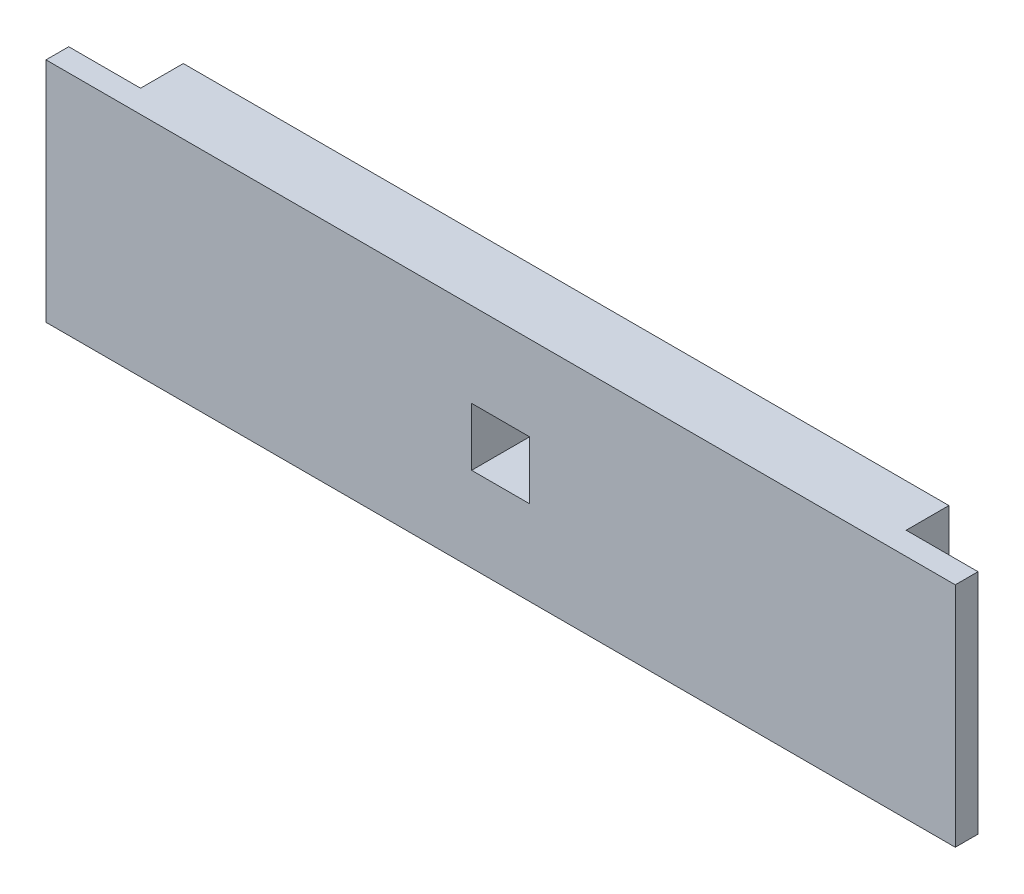
ISO-10303-21;
HEADER;
FILE_DESCRIPTION(('STEP AP214'),'2;1');
FILE_NAME('part.step','',(''),(''),'','','');
FILE_SCHEMA(('AUTOMOTIVE_DESIGN { 1 0 10303 214 1 1 1 1 }'));
ENDSEC;
DATA;
#1=APPLICATION_CONTEXT('core data for automotive mechanical design processes');
#2=APPLICATION_PROTOCOL_DEFINITION('international standard','automotive_design',2000,#1);
#3=PRODUCT_CONTEXT('',#1,'mechanical');
#4=PRODUCT('Part','Part','',(#3));
#5=PRODUCT_RELATED_PRODUCT_CATEGORY('part','',(#4));
#6=PRODUCT_DEFINITION_FORMATION('','',#4);
#7=PRODUCT_DEFINITION_CONTEXT('part definition',#1,'design');
#8=PRODUCT_DEFINITION('design','',#6,#7);
#9=PRODUCT_DEFINITION_SHAPE('','',#8);
#10=(LENGTH_UNIT() NAMED_UNIT(*) SI_UNIT(.MILLI.,.METRE.));
#11=(NAMED_UNIT(*) PLANE_ANGLE_UNIT() SI_UNIT($,.RADIAN.));
#12=(NAMED_UNIT(*) SI_UNIT($,.STERADIAN.) SOLID_ANGLE_UNIT());
#13=UNCERTAINTY_MEASURE_WITH_UNIT(LENGTH_MEASURE(1.E-05),#10,'distance_accuracy_value','');
#14=(GEOMETRIC_REPRESENTATION_CONTEXT(3) GLOBAL_UNCERTAINTY_ASSIGNED_CONTEXT((#13)) GLOBAL_UNIT_ASSIGNED_CONTEXT((#10,
#11,#12)) REPRESENTATION_CONTEXT('',''));
#15=CARTESIAN_POINT('',(0.,0.,0.));
#16=DIRECTION('',(0.,0.,1.));
#17=DIRECTION('',(1.,0.,0.));
#18=AXIS2_PLACEMENT_3D('',#15,#16,#17);
#19=CARTESIAN_POINT('',(0.,0.,18.288));
#20=DIRECTION('',(1.,0.,0.));
#21=DIRECTION('',(0.,0.,-1.));
#22=AXIS2_PLACEMENT_3D('',#19,#20,#21);
#23=PLANE('',#22);
#24=DIRECTION('',(0.,-1.,0.));
#25=VECTOR('',#24,1.);
#26=CARTESIAN_POINT('',(0.,63.5,11.938));
#27=LINE('',#26,#25);
#28=CARTESIAN_POINT('',(0.,63.5,11.938));
#29=VERTEX_POINT('',#28);
#30=CARTESIAN_POINT('',(0.,0.,11.938));
#31=VERTEX_POINT('',#30);
#32=EDGE_CURVE('E187',#29,#31,#27,.T.);
#33=ORIENTED_EDGE('',*,*,#32,.T.);
#34=DIRECTION('',(0.,0.,-1.));
#35=VECTOR('',#34,1.);
#36=CARTESIAN_POINT('',(0.,0.,18.288));
#37=LINE('',#36,#35);
#38=CARTESIAN_POINT('',(0.,0.,18.288));
#39=VERTEX_POINT('',#38);
#40=EDGE_CURVE('E12',#39,#31,#37,.T.);
#41=ORIENTED_EDGE('',*,*,#40,.F.);
#42=DIRECTION('',(0.,-1.,0.));
#43=VECTOR('',#42,1.);
#44=CARTESIAN_POINT('',(0.,0.,18.288));
#45=LINE('',#44,#43);
#46=CARTESIAN_POINT('',(0.,63.5,18.288));
#47=VERTEX_POINT('',#46);
#48=EDGE_CURVE('E144',#47,#39,#45,.T.);
#49=ORIENTED_EDGE('',*,*,#48,.F.);
#50=DIRECTION('',(0.,0.,-1.));
#51=VECTOR('',#50,1.);
#52=CARTESIAN_POINT('',(0.,63.5,18.288));
#53=LINE('',#52,#51);
#54=EDGE_CURVE('E154',#47,#29,#53,.T.);
#55=ORIENTED_EDGE('',*,*,#54,.T.);
#56=EDGE_LOOP('',(#33,#41,#49,#55));
#57=FACE_BOUND('',#56,.T.);
#58=ADVANCED_FACE('F36',(#57),#23,.F.);
#59=CARTESIAN_POINT('',(254.,0.,18.288));
#60=DIRECTION('',(-1.,0.,0.));
#61=DIRECTION('',(0.,0.,1.));
#62=AXIS2_PLACEMENT_3D('',#59,#60,#61);
#63=PLANE('',#62);
#64=DIRECTION('',(0.,1.,0.));
#65=VECTOR('',#64,1.);
#66=CARTESIAN_POINT('',(254.,63.5,11.938));
#67=LINE('',#66,#65);
#68=CARTESIAN_POINT('',(254.,0.,11.938));
#69=VERTEX_POINT('',#68);
#70=CARTESIAN_POINT('',(254.,63.5,11.938));
#71=VERTEX_POINT('',#70);
#72=EDGE_CURVE('E166',#69,#71,#67,.T.);
#73=ORIENTED_EDGE('',*,*,#72,.T.);
#74=DIRECTION('',(0.,0.,-1.));
#75=VECTOR('',#74,1.);
#76=CARTESIAN_POINT('',(254.,63.5,18.288));
#77=LINE('',#76,#75);
#78=CARTESIAN_POINT('',(254.,63.5,18.288));
#79=VERTEX_POINT('',#78);
#80=EDGE_CURVE('E157',#79,#71,#77,.T.);
#81=ORIENTED_EDGE('',*,*,#80,.F.);
#82=DIRECTION('',(0.,1.,0.));
#83=VECTOR('',#82,1.);
#84=CARTESIAN_POINT('',(254.,0.,18.288));
#85=LINE('',#84,#83);
#86=CARTESIAN_POINT('',(254.,0.,18.288));
#87=VERTEX_POINT('',#86);
#88=EDGE_CURVE('E167',#87,#79,#85,.T.);
#89=ORIENTED_EDGE('',*,*,#88,.F.);
#90=DIRECTION('',(0.,0.,-1.));
#91=VECTOR('',#90,1.);
#92=CARTESIAN_POINT('',(254.,0.,18.288));
#93=LINE('',#92,#91);
#94=EDGE_CURVE('E43',#87,#69,#93,.T.);
#95=ORIENTED_EDGE('',*,*,#94,.T.);
#96=EDGE_LOOP('',(#73,#81,#89,#95));
#97=FACE_BOUND('',#96,.T.);
#98=ADVANCED_FACE('F164',(#97),#63,.F.);
#99=CARTESIAN_POINT('',(0.,0.,18.288));
#100=DIRECTION('',(0.,1.,0.));
#101=DIRECTION('',(0.,0.,1.));
#102=AXIS2_PLACEMENT_3D('',#99,#100,#101);
#103=PLANE('',#102);
#104=DIRECTION('',(1.,0.,0.));
#105=VECTOR('',#104,1.);
#106=CARTESIAN_POINT('',(0.,0.,0.));
#107=LINE('',#106,#105);
#108=CARTESIAN_POINT('',(20.066,0.,0.));
#109=VERTEX_POINT('',#108);
#110=CARTESIAN_POINT('',(233.934,0.,0.));
#111=VERTEX_POINT('',#110);
#112=EDGE_CURVE('E145',#109,#111,#107,.T.);
#113=ORIENTED_EDGE('',*,*,#112,.T.);
#114=DIRECTION('',(0.,0.,-1.));
#115=VECTOR('',#114,1.);
#116=CARTESIAN_POINT('',(233.934,0.,84.8830024851716));
#117=LINE('',#116,#115);
#118=CARTESIAN_POINT('',(233.934,0.,11.938));
#119=VERTEX_POINT('',#118);
#120=EDGE_CURVE('E50',#119,#111,#117,.T.);
#121=ORIENTED_EDGE('',*,*,#120,.F.);
#122=DIRECTION('',(1.,0.,0.));
#123=VECTOR('',#122,1.);
#124=CARTESIAN_POINT('',(254.,0.,11.938));
#125=LINE('',#124,#123);
#126=EDGE_CURVE('E139',#119,#69,#125,.T.);
#127=ORIENTED_EDGE('',*,*,#126,.T.);
#128=ORIENTED_EDGE('',*,*,#94,.F.);
#129=DIRECTION('',(1.,0.,0.));
#130=VECTOR('',#129,1.);
#131=CARTESIAN_POINT('',(0.,0.,18.288));
#132=LINE('',#131,#130);
#133=EDGE_CURVE('E148',#39,#87,#132,.T.);
#134=ORIENTED_EDGE('',*,*,#133,.F.);
#135=ORIENTED_EDGE('',*,*,#40,.T.);
#136=DIRECTION('',(1.,0.,0.));
#137=VECTOR('',#136,1.);
#138=CARTESIAN_POINT('',(0.,0.,11.938));
#139=LINE('',#138,#137);
#140=CARTESIAN_POINT('',(20.066,0.,11.938));
#141=VERTEX_POINT('',#140);
#142=EDGE_CURVE('E183',#31,#141,#139,.T.);
#143=ORIENTED_EDGE('',*,*,#142,.T.);
#144=DIRECTION('',(0.,0.,-1.));
#145=VECTOR('',#144,1.);
#146=CARTESIAN_POINT('',(20.066,0.,84.8830024851716));
#147=LINE('',#146,#145);
#148=EDGE_CURVE('E184',#141,#109,#147,.T.);
#149=ORIENTED_EDGE('',*,*,#148,.T.);
#150=EDGE_LOOP('',(#113,#121,#127,#128,#134,#135,#143,#149));
#151=FACE_BOUND('',#150,.T.);
#152=ADVANCED_FACE('F170',(#151),#103,.F.);
#153=CARTESIAN_POINT('',(0.,63.5,18.288));
#154=DIRECTION('',(0.,-1.,0.));
#155=DIRECTION('',(0.,0.,-1.));
#156=AXIS2_PLACEMENT_3D('',#153,#154,#155);
#157=PLANE('',#156);
#158=DIRECTION('',(-1.,0.,0.));
#159=VECTOR('',#158,1.);
#160=CARTESIAN_POINT('',(233.934,63.5,11.938));
#161=LINE('',#160,#159);
#162=CARTESIAN_POINT('',(233.934,63.5,11.938));
#163=VERTEX_POINT('',#162);
#164=EDGE_CURVE('E138',#71,#163,#161,.T.);
#165=ORIENTED_EDGE('',*,*,#164,.T.);
#166=DIRECTION('',(0.,0.,-1.));
#167=VECTOR('',#166,1.);
#168=CARTESIAN_POINT('',(233.934,63.5,84.8830024851716));
#169=LINE('',#168,#167);
#170=CARTESIAN_POINT('',(233.934,63.5,0.));
#171=VERTEX_POINT('',#170);
#172=EDGE_CURVE('E125',#163,#171,#169,.T.);
#173=ORIENTED_EDGE('',*,*,#172,.T.);
#174=DIRECTION('',(-1.,0.,0.));
#175=VECTOR('',#174,1.);
#176=CARTESIAN_POINT('',(0.,63.5,0.));
#177=LINE('',#176,#175);
#178=CARTESIAN_POINT('',(20.066,63.5,0.));
#179=VERTEX_POINT('',#178);
#180=EDGE_CURVE('E136',#171,#179,#177,.T.);
#181=ORIENTED_EDGE('',*,*,#180,.T.);
#182=DIRECTION('',(0.,0.,-1.));
#183=VECTOR('',#182,1.);
#184=CARTESIAN_POINT('',(20.066,63.5,84.8830024851716));
#185=LINE('',#184,#183);
#186=CARTESIAN_POINT('',(20.066,63.5,11.938));
#187=VERTEX_POINT('',#186);
#188=EDGE_CURVE('E58',#187,#179,#185,.T.);
#189=ORIENTED_EDGE('',*,*,#188,.F.);
#190=DIRECTION('',(-1.,0.,0.));
#191=VECTOR('',#190,1.);
#192=CARTESIAN_POINT('',(20.066,63.5,11.938));
#193=LINE('',#192,#191);
#194=EDGE_CURVE('E131',#187,#29,#193,.T.);
#195=ORIENTED_EDGE('',*,*,#194,.T.);
#196=ORIENTED_EDGE('',*,*,#54,.F.);
#197=DIRECTION('',(-1.,0.,0.));
#198=VECTOR('',#197,1.);
#199=CARTESIAN_POINT('',(0.,63.5,18.288));
#200=LINE('',#199,#198);
#201=EDGE_CURVE('E158',#79,#47,#200,.T.);
#202=ORIENTED_EDGE('',*,*,#201,.F.);
#203=ORIENTED_EDGE('',*,*,#80,.T.);
#204=EDGE_LOOP('',(#165,#173,#181,#189,#195,#196,#202,#203));
#205=FACE_BOUND('',#204,.T.);
#206=ADVANCED_FACE('F135',(#205),#157,.F.);
#207=CARTESIAN_POINT('',(0.,0.,18.288));
#208=DIRECTION('',(0.,0.,-1.));
#209=DIRECTION('',(-1.,0.,0.));
#210=AXIS2_PLACEMENT_3D('',#207,#208,#209);
#211=PLANE('',#210);
#212=DIRECTION('',(-1.,0.,0.));
#213=VECTOR('',#212,1.);
#214=CARTESIAN_POINT('',(118.8974,39.8526,18.288));
#215=LINE('',#214,#213);
#216=CARTESIAN_POINT('',(135.1026,39.8526,18.288));
#217=VERTEX_POINT('',#216);
#218=CARTESIAN_POINT('',(118.8974,39.8526,18.288));
#219=VERTEX_POINT('',#218);
#220=EDGE_CURVE('E211',#217,#219,#215,.T.);
#221=ORIENTED_EDGE('',*,*,#220,.F.);
#222=DIRECTION('',(0.,1.,0.));
#223=VECTOR('',#222,1.);
#224=CARTESIAN_POINT('',(135.1026,23.6474,18.288));
#225=LINE('',#224,#223);
#226=CARTESIAN_POINT('',(135.1026,23.6474,18.288));
#227=VERTEX_POINT('',#226);
#228=EDGE_CURVE('E180',#227,#217,#225,.T.);
#229=ORIENTED_EDGE('',*,*,#228,.F.);
#230=DIRECTION('',(1.,0.,0.));
#231=VECTOR('',#230,1.);
#232=CARTESIAN_POINT('',(118.8974,23.6474,18.288));
#233=LINE('',#232,#231);
#234=CARTESIAN_POINT('',(118.8974,23.6474,18.288));
#235=VERTEX_POINT('',#234);
#236=EDGE_CURVE('E200',#235,#227,#233,.T.);
#237=ORIENTED_EDGE('',*,*,#236,.F.);
#238=DIRECTION('',(0.,-1.,0.));
#239=VECTOR('',#238,1.);
#240=CARTESIAN_POINT('',(118.8974,23.6474,18.288));
#241=LINE('',#240,#239);
#242=EDGE_CURVE('E214',#219,#235,#241,.T.);
#243=ORIENTED_EDGE('',*,*,#242,.F.);
#244=EDGE_LOOP('',(#221,#229,#237,#243));
#245=FACE_BOUND('',#244,.T.);
#246=ORIENTED_EDGE('',*,*,#48,.T.);
#247=ORIENTED_EDGE('',*,*,#133,.T.);
#248=ORIENTED_EDGE('',*,*,#88,.T.);
#249=ORIENTED_EDGE('',*,*,#201,.T.);
#250=EDGE_LOOP('',(#246,#247,#248,#249));
#251=FACE_BOUND('',#250,.T.);
#252=ADVANCED_FACE('F230',(#245,#251),#211,.F.);
#253=CARTESIAN_POINT('',(0.,0.,0.));
#254=DIRECTION('',(0.,0.,-1.));
#255=DIRECTION('',(-1.,0.,0.));
#256=AXIS2_PLACEMENT_3D('',#253,#254,#255);
#257=PLANE('',#256);
#258=DIRECTION('',(0.,1.,0.));
#259=VECTOR('',#258,1.);
#260=CARTESIAN_POINT('',(233.934,63.5,0.));
#261=LINE('',#260,#259);
#262=EDGE_CURVE('E122',#111,#171,#261,.T.);
#263=ORIENTED_EDGE('',*,*,#262,.F.);
#264=ORIENTED_EDGE('',*,*,#112,.F.);
#265=DIRECTION('',(0.,-1.,0.));
#266=VECTOR('',#265,1.);
#267=CARTESIAN_POINT('',(20.066,63.5,0.));
#268=LINE('',#267,#266);
#269=EDGE_CURVE('E143',#179,#109,#268,.T.);
#270=ORIENTED_EDGE('',*,*,#269,.F.);
#271=ORIENTED_EDGE('',*,*,#180,.F.);
#272=EDGE_LOOP('',(#263,#264,#270,#271));
#273=FACE_BOUND('',#272,.T.);
#274=DIRECTION('',(0.,1.,0.));
#275=VECTOR('',#274,1.);
#276=CARTESIAN_POINT('',(135.1026,23.6474,0.));
#277=LINE('',#276,#275);
#278=CARTESIAN_POINT('',(135.1026,23.6474,0.));
#279=VERTEX_POINT('',#278);
#280=CARTESIAN_POINT('',(135.1026,39.8526,0.));
#281=VERTEX_POINT('',#280);
#282=EDGE_CURVE('E196',#279,#281,#277,.T.);
#283=ORIENTED_EDGE('',*,*,#282,.T.);
#284=DIRECTION('',(-1.,0.,0.));
#285=VECTOR('',#284,1.);
#286=CARTESIAN_POINT('',(118.8974,39.8526,0.));
#287=LINE('',#286,#285);
#288=CARTESIAN_POINT('',(118.8974,39.8526,0.));
#289=VERTEX_POINT('',#288);
#290=EDGE_CURVE('E199',#281,#289,#287,.T.);
#291=ORIENTED_EDGE('',*,*,#290,.T.);
#292=DIRECTION('',(0.,-1.,0.));
#293=VECTOR('',#292,1.);
#294=CARTESIAN_POINT('',(118.8974,23.6474,0.));
#295=LINE('',#294,#293);
#296=CARTESIAN_POINT('',(118.8974,23.6474,0.));
#297=VERTEX_POINT('',#296);
#298=EDGE_CURVE('E203',#289,#297,#295,.T.);
#299=ORIENTED_EDGE('',*,*,#298,.T.);
#300=DIRECTION('',(1.,0.,0.));
#301=VECTOR('',#300,1.);
#302=CARTESIAN_POINT('',(118.8974,23.6474,0.));
#303=LINE('',#302,#301);
#304=EDGE_CURVE('E206',#297,#279,#303,.T.);
#305=ORIENTED_EDGE('',*,*,#304,.T.);
#306=EDGE_LOOP('',(#283,#291,#299,#305));
#307=FACE_BOUND('',#306,.T.);
#308=ADVANCED_FACE('F141',(#273,#307),#257,.T.);
#309=CARTESIAN_POINT('',(135.1026,23.6474,0.));
#310=DIRECTION('',(1.,0.,0.));
#311=DIRECTION('',(0.,0.,-1.));
#312=AXIS2_PLACEMENT_3D('',#309,#310,#311);
#313=PLANE('',#312);
#314=ORIENTED_EDGE('',*,*,#228,.T.);
#315=DIRECTION('',(0.,0.,1.));
#316=VECTOR('',#315,1.);
#317=CARTESIAN_POINT('',(135.1026,39.8526,0.));
#318=LINE('',#317,#316);
#319=EDGE_CURVE('E209',#281,#217,#318,.T.);
#320=ORIENTED_EDGE('',*,*,#319,.F.);
#321=ORIENTED_EDGE('',*,*,#282,.F.);
#322=DIRECTION('',(0.,0.,1.));
#323=VECTOR('',#322,1.);
#324=CARTESIAN_POINT('',(135.1026,23.6474,0.));
#325=LINE('',#324,#323);
#326=EDGE_CURVE('E150',#279,#227,#325,.T.);
#327=ORIENTED_EDGE('',*,*,#326,.T.);
#328=EDGE_LOOP('',(#314,#320,#321,#327));
#329=FACE_BOUND('',#328,.T.);
#330=ADVANCED_FACE('F264',(#329),#313,.F.);
#331=CARTESIAN_POINT('',(118.8974,23.6474,0.));
#332=DIRECTION('',(0.,-1.,0.));
#333=DIRECTION('',(1.,0.,0.));
#334=AXIS2_PLACEMENT_3D('',#331,#332,#333);
#335=PLANE('',#334);
#336=ORIENTED_EDGE('',*,*,#236,.T.);
#337=ORIENTED_EDGE('',*,*,#326,.F.);
#338=ORIENTED_EDGE('',*,*,#304,.F.);
#339=DIRECTION('',(0.,0.,1.));
#340=VECTOR('',#339,1.);
#341=CARTESIAN_POINT('',(118.8974,23.6474,0.));
#342=LINE('',#341,#340);
#343=EDGE_CURVE('E220',#297,#235,#342,.T.);
#344=ORIENTED_EDGE('',*,*,#343,.T.);
#345=EDGE_LOOP('',(#336,#337,#338,#344));
#346=FACE_BOUND('',#345,.T.);
#347=ADVANCED_FACE('F269',(#346),#335,.F.);
#348=CARTESIAN_POINT('',(118.8974,23.6474,0.));
#349=DIRECTION('',(-1.,0.,0.));
#350=DIRECTION('',(0.,0.,1.));
#351=AXIS2_PLACEMENT_3D('',#348,#349,#350);
#352=PLANE('',#351);
#353=ORIENTED_EDGE('',*,*,#242,.T.);
#354=ORIENTED_EDGE('',*,*,#343,.F.);
#355=ORIENTED_EDGE('',*,*,#298,.F.);
#356=DIRECTION('',(0.,0.,1.));
#357=VECTOR('',#356,1.);
#358=CARTESIAN_POINT('',(118.8974,39.8526,0.));
#359=LINE('',#358,#357);
#360=EDGE_CURVE('E222',#289,#219,#359,.T.);
#361=ORIENTED_EDGE('',*,*,#360,.T.);
#362=EDGE_LOOP('',(#353,#354,#355,#361));
#363=FACE_BOUND('',#362,.T.);
#364=ADVANCED_FACE('F247',(#363),#352,.F.);
#365=CARTESIAN_POINT('',(118.8974,39.8526,0.));
#366=DIRECTION('',(0.,1.,0.));
#367=DIRECTION('',(0.,0.,1.));
#368=AXIS2_PLACEMENT_3D('',#365,#366,#367);
#369=PLANE('',#368);
#370=ORIENTED_EDGE('',*,*,#220,.T.);
#371=ORIENTED_EDGE('',*,*,#360,.F.);
#372=ORIENTED_EDGE('',*,*,#290,.F.);
#373=ORIENTED_EDGE('',*,*,#319,.T.);
#374=EDGE_LOOP('',(#370,#371,#372,#373));
#375=FACE_BOUND('',#374,.T.);
#376=ADVANCED_FACE('F240',(#375),#369,.F.);
#377=CARTESIAN_POINT('',(20.066,63.5,84.8830024851716));
#378=DIRECTION('',(1.,0.,0.));
#379=DIRECTION('',(0.,1.,0.));
#380=AXIS2_PLACEMENT_3D('',#377,#378,#379);
#381=PLANE('',#380);
#382=DIRECTION('',(0.,1.,0.));
#383=VECTOR('',#382,1.);
#384=CARTESIAN_POINT('',(20.066,63.5,11.938));
#385=LINE('',#384,#383);
#386=EDGE_CURVE('E181',#141,#187,#385,.T.);
#387=ORIENTED_EDGE('',*,*,#386,.T.);
#388=ORIENTED_EDGE('',*,*,#188,.T.);
#389=ORIENTED_EDGE('',*,*,#269,.T.);
#390=ORIENTED_EDGE('',*,*,#148,.F.);
#391=EDGE_LOOP('',(#387,#388,#389,#390));
#392=FACE_BOUND('',#391,.T.);
#393=ADVANCED_FACE('F238',(#392),#381,.F.);
#394=CARTESIAN_POINT('',(0.,0.,11.938));
#395=DIRECTION('',(0.,0.,-1.));
#396=DIRECTION('',(-1.,0.,0.));
#397=AXIS2_PLACEMENT_3D('',#394,#395,#396);
#398=PLANE('',#397);
#399=ORIENTED_EDGE('',*,*,#32,.F.);
#400=ORIENTED_EDGE('',*,*,#194,.F.);
#401=ORIENTED_EDGE('',*,*,#386,.F.);
#402=ORIENTED_EDGE('',*,*,#142,.F.);
#403=EDGE_LOOP('',(#399,#400,#401,#402));
#404=FACE_BOUND('',#403,.T.);
#405=ADVANCED_FACE('F237',(#404),#398,.T.);
#406=CARTESIAN_POINT('',(233.934,63.5,84.8830024851716));
#407=DIRECTION('',(-1.,0.,0.));
#408=DIRECTION('',(0.,0.,1.));
#409=AXIS2_PLACEMENT_3D('',#406,#407,#408);
#410=PLANE('',#409);
#411=DIRECTION('',(0.,-1.,0.));
#412=VECTOR('',#411,1.);
#413=CARTESIAN_POINT('',(233.934,63.5,11.938));
#414=LINE('',#413,#412);
#415=EDGE_CURVE('E173',#163,#119,#414,.T.);
#416=ORIENTED_EDGE('',*,*,#415,.T.);
#417=ORIENTED_EDGE('',*,*,#120,.T.);
#418=ORIENTED_EDGE('',*,*,#262,.T.);
#419=ORIENTED_EDGE('',*,*,#172,.F.);
#420=EDGE_LOOP('',(#416,#417,#418,#419));
#421=FACE_BOUND('',#420,.T.);
#422=ADVANCED_FACE('F124',(#421),#410,.F.);
#423=CARTESIAN_POINT('',(0.,0.,11.938));
#424=DIRECTION('',(0.,0.,-1.));
#425=DIRECTION('',(-1.,0.,0.));
#426=AXIS2_PLACEMENT_3D('',#423,#424,#425);
#427=PLANE('',#426);
#428=ORIENTED_EDGE('',*,*,#164,.F.);
#429=ORIENTED_EDGE('',*,*,#72,.F.);
#430=ORIENTED_EDGE('',*,*,#126,.F.);
#431=ORIENTED_EDGE('',*,*,#415,.F.);
#432=EDGE_LOOP('',(#428,#429,#430,#431));
#433=FACE_BOUND('',#432,.T.);
#434=ADVANCED_FACE('F313',(#433),#427,.T.);
#435=CLOSED_SHELL('',(#58,#98,#152,#206,#252,#308,#330,#347,#364,#376,#393,#405,#422,#434));
#436=MANIFOLD_SOLID_BREP('B2',#435);
#437=ADVANCED_BREP_SHAPE_REPRESENTATION('',(#18,#436),#14);
#438=SHAPE_DEFINITION_REPRESENTATION(#9,#437);
ENDSEC;
END-ISO-10303-21;
